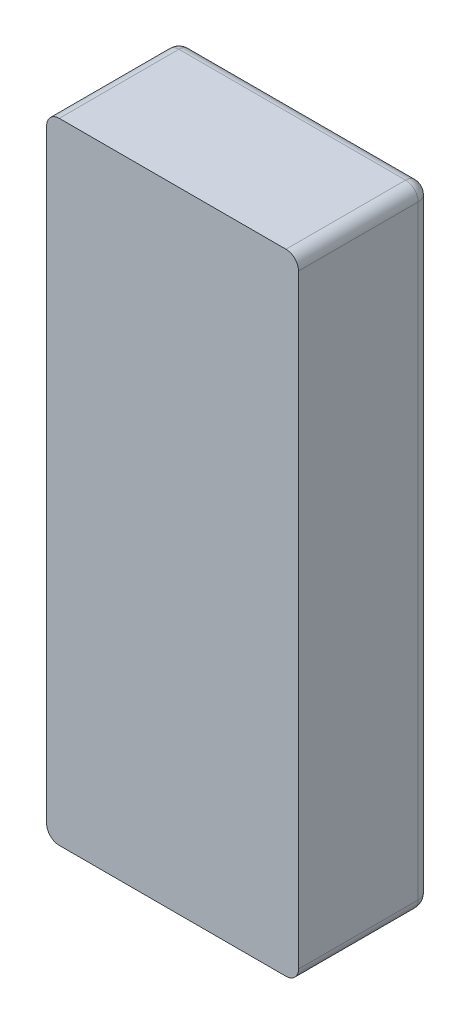
ISO-10303-21;
HEADER;
FILE_DESCRIPTION(('STEP AP214'),'2;1');
FILE_NAME('part.step','',(''),(''),'','','');
FILE_SCHEMA(('AUTOMOTIVE_DESIGN { 1 0 10303 214 1 1 1 1 }'));
ENDSEC;
DATA;
#1=APPLICATION_CONTEXT('core data for automotive mechanical design processes');
#2=APPLICATION_PROTOCOL_DEFINITION('international standard','automotive_design',2000,#1);
#3=PRODUCT_CONTEXT('',#1,'mechanical');
#4=PRODUCT('Part','Part','',(#3));
#5=PRODUCT_RELATED_PRODUCT_CATEGORY('part','',(#4));
#6=PRODUCT_DEFINITION_FORMATION('','',#4);
#7=PRODUCT_DEFINITION_CONTEXT('part definition',#1,'design');
#8=PRODUCT_DEFINITION('design','',#6,#7);
#9=PRODUCT_DEFINITION_SHAPE('','',#8);
#10=(LENGTH_UNIT() NAMED_UNIT(*) SI_UNIT(.MILLI.,.METRE.));
#11=(NAMED_UNIT(*) PLANE_ANGLE_UNIT() SI_UNIT($,.RADIAN.));
#12=(NAMED_UNIT(*) SI_UNIT($,.STERADIAN.) SOLID_ANGLE_UNIT());
#13=UNCERTAINTY_MEASURE_WITH_UNIT(LENGTH_MEASURE(1.E-05),#10,'distance_accuracy_value','');
#14=(GEOMETRIC_REPRESENTATION_CONTEXT(3) GLOBAL_UNCERTAINTY_ASSIGNED_CONTEXT((#13)) GLOBAL_UNIT_ASSIGNED_CONTEXT((#10,
#11,#12)) REPRESENTATION_CONTEXT('',''));
#15=CARTESIAN_POINT('',(0.,0.,0.));
#16=DIRECTION('',(0.,0.,1.));
#17=DIRECTION('',(1.,0.,0.));
#18=AXIS2_PLACEMENT_3D('',#15,#16,#17);
#19=CARTESIAN_POINT('',(60.00000122,78.000000648083,-2.156522083282));
#20=DIRECTION('',(0.,8.74227765734797E-08,-0.999999999999996));
#21=DIRECTION('',(0.,0.999999999999996,8.74227765734797E-08));
#22=AXIS2_PLACEMENT_3D('',#19,#20,#21);
#23=PLANE('',#22);
#24=DIRECTION('',(8.74227765734793E-08,0.999999999999992,8.74227765734793E-08));
#25=VECTOR('',#24,1.);
#26=CARTESIAN_POINT('',(59.5500011653604,77.3750006874231,-2.156522137922));
#27=LINE('',#26,#25);
#28=CARTESIAN_POINT('',(59.55000122,79.2000006874229,-2.15652197837505));
#29=VERTEX_POINT('',#28);
#30=CARTESIAN_POINT('',(59.5500011150927,76.800000687423,-2.15652218819005));
#31=VERTEX_POINT('',#30);
#32=EDGE_CURVE('E252',#29,#31,#27,.F.);
#33=ORIENTED_EDGE('',*,*,#32,.F.);
#34=DIRECTION('',(1.,0.,0.));
#35=VECTOR('',#34,1.);
#36=CARTESIAN_POINT('',(60.00000122,79.200000687423,-2.15652197837466));
#37=LINE('',#36,#35);
#38=CARTESIAN_POINT('',(60.4500013249069,79.2000006480825,-2.15652197837481));
#39=VERTEX_POINT('',#38);
#40=EDGE_CURVE('E260',#29,#39,#37,.T.);
#41=ORIENTED_EDGE('',*,*,#40,.T.);
#42=DIRECTION('',(-8.74227765734793E-08,-0.999999999999992,-8.74227765734793E-08));
#43=VECTOR('',#42,1.);
#44=CARTESIAN_POINT('',(60.450001274639,78.6250006087421,-2.156522028643));
#45=LINE('',#44,#43);
#46=CARTESIAN_POINT('',(60.4500011150927,76.8000006087424,-2.15652218818978));
#47=VERTEX_POINT('',#46);
#48=EDGE_CURVE('E96',#47,#39,#45,.F.);
#49=ORIENTED_EDGE('',*,*,#48,.F.);
#50=DIRECTION('',(-0.999999999999996,8.74227765734797E-08,0.));
#51=VECTOR('',#50,1.);
#52=CARTESIAN_POINT('',(60.250001115093,76.8000006262271,-2.15652218819));
#53=LINE('',#52,#51);
#54=EDGE_CURVE('E256',#31,#47,#53,.F.);
#55=ORIENTED_EDGE('',*,*,#54,.F.);
#56=EDGE_LOOP('',(#33,#41,#49,#55));
#57=FACE_BOUND('',#56,.T.);
#58=ADVANCED_FACE('F17',(#57),#23,.T.);
#59=CARTESIAN_POINT('',(60.450001274639,78.625000604371,-2.106522028643));
#60=DIRECTION('',(-8.74227765734793E-08,-0.999999999999992,-8.74227765734793E-08));
#61=DIRECTION('',(0.,8.74227765734797E-08,-0.999999999999996));
#62=AXIS2_PLACEMENT_3D('',#59,#60,#61);
#63=CYLINDRICAL_SURFACE('',#62,0.05);
#64=CARTESIAN_POINT('',(60.4500011150924,76.8000006043711,-2.10652218818957));
#65=DIRECTION('',(-8.74227765734793E-08,-0.999999999999992,-8.74227765734793E-08));
#66=DIRECTION('',(0.,8.74227765734797E-08,-0.999999999999996));
#67=AXIS2_PLACEMENT_3D('',#64,#65,#66);
#68=CIRCLE('',#67,0.05);
#69=CARTESIAN_POINT('',(60.5000011150926,76.8000006000001,-2.10652218818971));
#70=VERTEX_POINT('',#69);
#71=EDGE_CURVE('E20',#47,#70,#68,.T.);
#72=ORIENTED_EDGE('',*,*,#71,.F.);
#73=ORIENTED_EDGE('',*,*,#48,.T.);
#74=CARTESIAN_POINT('',(60.4500013249071,79.2000006043709,-2.1065219783749));
#75=DIRECTION('',(-8.74227765734793E-08,-0.999999999999992,-8.74227765734793E-08));
#76=DIRECTION('',(0.,8.74227765734797E-08,-0.999999999999996));
#77=AXIS2_PLACEMENT_3D('',#74,#75,#76);
#78=CIRCLE('',#77,0.05);
#79=CARTESIAN_POINT('',(60.5000013249069,79.2000005999999,-2.10652208328245));
#80=VERTEX_POINT('',#79);
#81=EDGE_CURVE('E227',#80,#39,#78,.F.);
#82=ORIENTED_EDGE('',*,*,#81,.F.);
#83=DIRECTION('',(8.74227765734797E-08,0.999999999999996,0.));
#84=VECTOR('',#83,1.);
#85=CARTESIAN_POINT('',(60.500001329278,79.250000556289,-2.10652218819));
#86=LINE('',#85,#84);
#87=EDGE_CURVE('E117',#70,#80,#86,.T.);
#88=ORIENTED_EDGE('',*,*,#87,.F.);
#89=EDGE_LOOP('',(#72,#73,#82,#88));
#90=FACE_BOUND('',#89,.T.);
#91=ADVANCED_FACE('F105',(#90),#63,.T.);
#92=CARTESIAN_POINT('',(60.450001115093,76.800000604371,-2.10652218819));
#93=DIRECTION('',(0.577350218716363,-0.577350269189147,-0.577350319663363));
#94=DIRECTION('',(0.707106781186431,-1.23634541937534E-07,0.707106781186653));
#95=AXIS2_PLACEMENT_3D('',#92,#93,#94);
#96=SPHERICAL_SURFACE('',#95,0.05);
#97=CARTESIAN_POINT('',(60.4788686260288,76.7711330909115,-2.13538970417317));
#98=VERTEX_POINT('',#97);
#99=VERTEX_LOOP('',#98);
#100=FACE_BOUND('',#99,.T.);
#101=CARTESIAN_POINT('',(60.450001115093,76.8000006043714,-2.10652218818986));
#102=DIRECTION('',(0.,8.74227765734797E-08,-0.999999999999996));
#103=DIRECTION('',(0.,0.999999999999996,8.74227765734797E-08));
#104=AXIS2_PLACEMENT_3D('',#101,#102,#103);
#105=CIRCLE('',#104,0.05);
#106=CARTESIAN_POINT('',(60.4500011107219,76.7500006043715,-2.10652219256107));
#107=VERTEX_POINT('',#106);
#108=EDGE_CURVE('E111',#107,#70,#105,.F.);
#109=ORIENTED_EDGE('',*,*,#108,.F.);
#110=CARTESIAN_POINT('',(60.450001115093,76.8000006043714,-2.10652218819));
#111=DIRECTION('',(-0.999999999999996,8.74227765734797E-08,0.));
#112=DIRECTION('',(-8.74227765734797E-08,-0.999999999999996,0.));
#113=AXIS2_PLACEMENT_3D('',#110,#111,#112);
#114=CIRCLE('',#113,0.05);
#115=EDGE_CURVE('E113',#47,#107,#114,.T.);
#116=ORIENTED_EDGE('',*,*,#115,.F.);
#117=ORIENTED_EDGE('',*,*,#71,.T.);
#118=EDGE_LOOP('',(#109,#116,#117));
#119=FACE_BOUND('',#118,.T.);
#120=ADVANCED_FACE('F101',(#100,#119),#96,.T.);
#121=CARTESIAN_POINT('',(60.250001115093,76.800000621856,-2.10652218819));
#122=DIRECTION('',(-0.999999999999996,8.74227765734797E-08,0.));
#123=DIRECTION('',(-8.74227765734797E-08,-0.999999999999996,0.));
#124=AXIS2_PLACEMENT_3D('',#121,#122,#123);
#125=CYLINDRICAL_SURFACE('',#124,0.05);
#126=CARTESIAN_POINT('',(59.5500011150931,76.8000006830519,-2.10652218818999));
#127=DIRECTION('',(-0.999999999999996,8.74227765734797E-08,0.));
#128=DIRECTION('',(-8.74227765734797E-08,-0.999999999999996,0.));
#129=AXIS2_PLACEMENT_3D('',#126,#127,#128);
#130=CIRCLE('',#129,0.05);
#131=CARTESIAN_POINT('',(59.5500011107219,76.7500006830517,-2.10652219256114));
#132=VERTEX_POINT('',#131);
#133=EDGE_CURVE('E255',#31,#132,#130,.T.);
#134=ORIENTED_EDGE('',*,*,#133,.F.);
#135=ORIENTED_EDGE('',*,*,#54,.T.);
#136=ORIENTED_EDGE('',*,*,#115,.T.);
#137=DIRECTION('',(0.999999999999996,-8.7422776573479E-08,0.));
#138=VECTOR('',#137,1.);
#139=CARTESIAN_POINT('',(60.500001110722,76.7500006000004,-2.10652219256101));
#140=LINE('',#139,#138);
#141=EDGE_CURVE('E129',#132,#107,#140,.T.);
#142=ORIENTED_EDGE('',*,*,#141,.F.);
#143=EDGE_LOOP('',(#134,#135,#136,#142));
#144=FACE_BOUND('',#143,.T.);
#145=ADVANCED_FACE('F104',(#144),#125,.T.);
#146=CARTESIAN_POINT('',(59.550001115093,76.800000683052,-2.10652218819));
#147=DIRECTION('',(-0.577350319663375,-0.577350168242114,-0.577350319663375));
#148=DIRECTION('',(0.707106781186548,0.,-0.707106781186548));
#149=AXIS2_PLACEMENT_3D('',#146,#147,#148);
#150=SPHERICAL_SURFACE('',#149,0.05);
#151=CARTESIAN_POINT('',(59.5211335991098,76.7711331746399,-2.13538970417317));
#152=VERTEX_POINT('',#151);
#153=VERTEX_LOOP('',#152);
#154=FACE_BOUND('',#153,.T.);
#155=CARTESIAN_POINT('',(59.550001115093,76.8000006830514,-2.10652218819));
#156=DIRECTION('',(0.,8.74227765734797E-08,-0.999999999999996));
#157=DIRECTION('',(0.,0.999999999999996,8.74227765734797E-08));
#158=AXIS2_PLACEMENT_3D('',#155,#156,#157);
#159=CIRCLE('',#158,0.05);
#160=CARTESIAN_POINT('',(59.5000011150931,76.800000687423,-2.10652208328255));
#161=VERTEX_POINT('',#160);
#162=EDGE_CURVE('E128',#161,#132,#159,.F.);
#163=ORIENTED_EDGE('',*,*,#162,.F.);
#164=CARTESIAN_POINT('',(59.5500011150929,76.8000006830519,-2.1065221881901));
#165=DIRECTION('',(8.74227765734793E-08,0.999999999999992,8.74227765734793E-08));
#166=DIRECTION('',(0.,-8.74227765734797E-08,0.999999999999996));
#167=AXIS2_PLACEMENT_3D('',#164,#165,#166);
#168=CIRCLE('',#167,0.05);
#169=EDGE_CURVE('E253',#31,#161,#168,.T.);
#170=ORIENTED_EDGE('',*,*,#169,.F.);
#171=ORIENTED_EDGE('',*,*,#133,.T.);
#172=EDGE_LOOP('',(#163,#170,#171));
#173=FACE_BOUND('',#172,.T.);
#174=ADVANCED_FACE('F173',(#154,#173),#150,.T.);
#175=CARTESIAN_POINT('',(59.550001165361,77.375000683052,-2.106522137922));
#176=DIRECTION('',(8.74227765734793E-08,0.999999999999992,8.74227765734793E-08));
#177=DIRECTION('',(0.,-8.74227765734797E-08,0.999999999999996));
#178=AXIS2_PLACEMENT_3D('',#175,#176,#177);
#179=CYLINDRICAL_SURFACE('',#178,0.05);
#180=CARTESIAN_POINT('',(59.5500013249076,79.2000006830519,-2.10652197837543));
#181=DIRECTION('',(8.74227765734793E-08,0.999999999999992,8.74227765734793E-08));
#182=DIRECTION('',(0.,-8.74227765734797E-08,0.999999999999996));
#183=AXIS2_PLACEMENT_3D('',#180,#181,#182);
#184=CIRCLE('',#183,0.05);
#185=CARTESIAN_POINT('',(59.5000013249074,79.2000006874228,-2.10652197837529));
#186=VERTEX_POINT('',#185);
#187=EDGE_CURVE('E250',#29,#186,#184,.T.);
#188=ORIENTED_EDGE('',*,*,#187,.F.);
#189=ORIENTED_EDGE('',*,*,#32,.T.);
#190=ORIENTED_EDGE('',*,*,#169,.T.);
#191=DIRECTION('',(-8.74227765734797E-08,-0.999999999999996,0.));
#192=VECTOR('',#191,1.);
#193=CARTESIAN_POINT('',(59.500001110722,76.750000643711,-2.106521978375));
#194=LINE('',#193,#192);
#195=EDGE_CURVE('E167',#186,#161,#194,.T.);
#196=ORIENTED_EDGE('',*,*,#195,.F.);
#197=EDGE_LOOP('',(#188,#189,#190,#196));
#198=FACE_BOUND('',#197,.T.);
#199=ADVANCED_FACE('F163',(#198),#179,.T.);
#200=CARTESIAN_POINT('',(59.550001324907,79.200000683052,-2.106521978375));
#201=DIRECTION('',(-0.577350218716104,0.577350370136657,-0.577350218716104));
#202=DIRECTION('',(0.707106781186548,0.,-0.707106781186548));
#203=AXIS2_PLACEMENT_3D('',#200,#201,#202);
#204=SPHERICAL_SURFACE('',#203,0.05);
#205=CARTESIAN_POINT('',(59.5211338139712,79.2288682015588,-2.1353894893108));
#206=VERTEX_POINT('',#205);
#207=VERTEX_LOOP('',#206);
#208=FACE_BOUND('',#207,.T.);
#209=CARTESIAN_POINT('',(59.550001324907,79.2000006830514,-2.10652197837514));
#210=DIRECTION('',(0.,8.74227765734797E-08,-0.999999999999996));
#211=DIRECTION('',(0.,0.999999999999996,8.74227765734797E-08));
#212=AXIS2_PLACEMENT_3D('',#209,#210,#211);
#213=CIRCLE('',#212,0.05);
#214=CARTESIAN_POINT('',(59.5500013292781,79.2500006830514,-2.10652197400393));
#215=VERTEX_POINT('',#214);
#216=EDGE_CURVE('E243',#215,#186,#213,.F.);
#217=ORIENTED_EDGE('',*,*,#216,.F.);
#218=CARTESIAN_POINT('',(59.550001324907,79.2000006830516,-2.106521978375));
#219=DIRECTION('',(0.999999999999996,-8.74227765734797E-08,0.));
#220=DIRECTION('',(8.74227765734797E-08,0.999999999999996,0.));
#221=AXIS2_PLACEMENT_3D('',#218,#219,#220);
#222=CIRCLE('',#221,0.05);
#223=EDGE_CURVE('E248',#29,#215,#222,.T.);
#224=ORIENTED_EDGE('',*,*,#223,.F.);
#225=ORIENTED_EDGE('',*,*,#187,.T.);
#226=EDGE_LOOP('',(#217,#224,#225));
#227=FACE_BOUND('',#226,.T.);
#228=ADVANCED_FACE('F158',(#208,#227),#204,.T.);
#229=CARTESIAN_POINT('',(59.750001324907,79.200000665567,-2.106521978375));
#230=DIRECTION('',(0.999999999999996,-8.74227765734797E-08,0.));
#231=DIRECTION('',(8.74227765734797E-08,0.999999999999996,0.));
#232=AXIS2_PLACEMENT_3D('',#229,#230,#231);
#233=CYLINDRICAL_SURFACE('',#232,0.05);
#234=CARTESIAN_POINT('',(60.4500013249069,79.2000006043711,-2.10652197837501));
#235=DIRECTION('',(0.999999999999996,-8.74227765734797E-08,0.));
#236=DIRECTION('',(8.74227765734797E-08,0.999999999999996,0.));
#237=AXIS2_PLACEMENT_3D('',#234,#235,#236);
#238=CIRCLE('',#237,0.05);
#239=CARTESIAN_POINT('',(60.4500013270926,79.2500006043711,-2.10652197400386));
#240=VERTEX_POINT('',#239);
#241=EDGE_CURVE('E235',#39,#240,#238,.T.);
#242=ORIENTED_EDGE('',*,*,#241,.F.);
#243=ORIENTED_EDGE('',*,*,#40,.F.);
#244=ORIENTED_EDGE('',*,*,#223,.T.);
#245=DIRECTION('',(0.999999999999996,-8.7422776573479E-08,0.));
#246=VECTOR('',#245,1.);
#247=CARTESIAN_POINT('',(59.500001329278,79.2500006874224,-2.10652197400399));
#248=LINE('',#247,#246);
#249=EDGE_CURVE('E139',#240,#215,#248,.F.);
#250=ORIENTED_EDGE('',*,*,#249,.F.);
#251=EDGE_LOOP('',(#242,#243,#244,#250));
#252=FACE_BOUND('',#251,.T.);
#253=ADVANCED_FACE('F153',(#252),#233,.T.);
#254=CARTESIAN_POINT('',(60.450001324907,79.200000604371,-2.106521978375));
#255=DIRECTION('',(0.577350319663363,0.577350269189147,-0.577350218716363));
#256=DIRECTION('',(0.707106781186653,-1.23634541937534E-07,0.707106781186431));
#257=AXIS2_PLACEMENT_3D('',#254,#255,#256);
#258=SPHERICAL_SURFACE('',#257,0.05);
#259=CARTESIAN_POINT('',(60.4788688408902,79.2288681178305,-2.13538948931082));
#260=VERTEX_POINT('',#259);
#261=VERTEX_LOOP('',#260);
#262=FACE_BOUND('',#261,.T.);
#263=CARTESIAN_POINT('',(60.450001324907,79.2000006043714,-2.106521978375));
#264=DIRECTION('',(0.,8.74227765734797E-08,-0.999999999999996));
#265=DIRECTION('',(0.,0.999999999999996,8.74227765734797E-08));
#266=AXIS2_PLACEMENT_3D('',#263,#264,#265);
#267=CIRCLE('',#266,0.05);
#268=EDGE_CURVE('E229',#80,#240,#267,.F.);
#269=ORIENTED_EDGE('',*,*,#268,.F.);
#270=ORIENTED_EDGE('',*,*,#81,.T.);
#271=ORIENTED_EDGE('',*,*,#241,.T.);
#272=EDGE_LOOP('',(#269,#270,#271));
#273=FACE_BOUND('',#272,.T.);
#274=ADVANCED_FACE('F148',(#262,#273),#258,.T.);
#275=CARTESIAN_POINT('',(60.500001329278,79.250000556289,-1.606521974004));
#276=DIRECTION('',(0.999999999999996,-8.74227765734797E-08,0.));
#277=DIRECTION('',(8.74227765734797E-08,0.999999999999996,0.));
#278=AXIS2_PLACEMENT_3D('',#275,#276,#277);
#279=PLANE('',#278);
#280=ORIENTED_EDGE('',*,*,#87,.T.);
#281=DIRECTION('',(0.,8.74227765734797E-08,-0.999999999999996));
#282=VECTOR('',#281,1.);
#283=CARTESIAN_POINT('',(60.500001324907,79.2000005562884,-1.606521978375));
#284=LINE('',#283,#282);
#285=CARTESIAN_POINT('',(60.500001324907,79.2000005606598,-1.63152197837514));
#286=VERTEX_POINT('',#285);
#287=EDGE_CURVE('E225',#286,#80,#284,.T.);
#288=ORIENTED_EDGE('',*,*,#287,.F.);
#289=DIRECTION('',(0.,0.999999999999996,8.74227765734797E-08));
#290=VECTOR('',#289,1.);
#291=CARTESIAN_POINT('',(60.500001324907,81.118392505247,-1.631521810664));
#292=LINE('',#291,#290);
#293=CARTESIAN_POINT('',(60.50000122,76.8000005606599,-1.63152218819));
#294=VERTEX_POINT('',#293);
#295=EDGE_CURVE('E238',#286,#294,#292,.F.);
#296=ORIENTED_EDGE('',*,*,#295,.T.);
#297=DIRECTION('',(0.,8.74227765734797E-08,-0.999999999999996));
#298=VECTOR('',#297,1.);
#299=CARTESIAN_POINT('',(60.500001115093,76.8000005562886,-1.60652218819));
#300=LINE('',#299,#298);
#301=EDGE_CURVE('E116',#70,#294,#300,.F.);
#302=ORIENTED_EDGE('',*,*,#301,.F.);
#303=EDGE_LOOP('',(#280,#288,#296,#302));
#304=FACE_BOUND('',#303,.T.);
#305=ADVANCED_FACE('F152',(#304),#279,.T.);
#306=CARTESIAN_POINT('',(60.450001115093,76.80000056066,-1.60652218819));
#307=DIRECTION('',(0.,8.74227765734797E-08,-0.999999999999996));
#308=DIRECTION('',(0.,0.999999999999996,8.74227765734797E-08));
#309=AXIS2_PLACEMENT_3D('',#306,#307,#308);
#310=CYLINDRICAL_SURFACE('',#309,0.05);
#311=ORIENTED_EDGE('',*,*,#108,.T.);
#312=ORIENTED_EDGE('',*,*,#301,.T.);
#313=CARTESIAN_POINT('',(60.450001115093,76.8000005628456,-1.63152218819));
#314=DIRECTION('',(0.,8.74227765734797E-08,-0.999999999999996));
#315=DIRECTION('',(0.,0.999999999999996,8.74227765734797E-08));
#316=AXIS2_PLACEMENT_3D('',#313,#314,#315);
#317=CIRCLE('',#316,0.05);
#318=CARTESIAN_POINT('',(60.4500011129075,76.7500005628454,-1.63152219256114));
#319=VERTEX_POINT('',#318);
#320=EDGE_CURVE('E123',#294,#319,#317,.T.);
#321=ORIENTED_EDGE('',*,*,#320,.T.);
#322=DIRECTION('',(0.,8.74227765734797E-08,-0.999999999999996));
#323=VECTOR('',#322,1.);
#324=CARTESIAN_POINT('',(60.450001110722,76.7500005606601,-1.606522192561));
#325=LINE('',#324,#323);
#326=EDGE_CURVE('E120',#107,#319,#325,.F.);
#327=ORIENTED_EDGE('',*,*,#326,.F.);
#328=EDGE_LOOP('',(#311,#312,#321,#327));
#329=FACE_BOUND('',#328,.T.);
#330=ADVANCED_FACE('F121',(#329),#310,.T.);
#331=CARTESIAN_POINT('',(60.500001110722,76.750000556289,-1.606522192561));
#332=DIRECTION('',(-8.74227765734793E-08,-0.999999999999992,-8.74227765734793E-08));
#333=DIRECTION('',(0.,8.74227765734797E-08,-0.999999999999996));
#334=AXIS2_PLACEMENT_3D('',#331,#332,#333);
#335=PLANE('',#334);
#336=ORIENTED_EDGE('',*,*,#141,.T.);
#337=ORIENTED_EDGE('',*,*,#326,.T.);
#338=DIRECTION('',(1.,0.,0.));
#339=VECTOR('',#338,1.);
#340=CARTESIAN_POINT('',(59.500001492618,76.750000562845,-1.63152219256095));
#341=LINE('',#340,#339);
#342=CARTESIAN_POINT('',(59.5500011129075,76.7500006021853,-1.631522192561));
#343=VERTEX_POINT('',#342);
#344=EDGE_CURVE('E270',#319,#343,#341,.F.);
#345=ORIENTED_EDGE('',*,*,#344,.T.);
#346=DIRECTION('',(0.,8.74227765734797E-08,-0.999999999999996));
#347=VECTOR('',#346,1.);
#348=CARTESIAN_POINT('',(59.550001110722,76.75000063934,-1.60652219256114));
#349=LINE('',#348,#347);
#350=EDGE_CURVE('E132',#132,#343,#349,.F.);
#351=ORIENTED_EDGE('',*,*,#350,.F.);
#352=EDGE_LOOP('',(#336,#337,#345,#351));
#353=FACE_BOUND('',#352,.T.);
#354=ADVANCED_FACE('F211',(#353),#335,.T.);
#355=CARTESIAN_POINT('',(59.550001115093,76.80000063934,-1.60652218819));
#356=DIRECTION('',(0.,8.74227765734797E-08,-0.999999999999996));
#357=DIRECTION('',(0.,0.999999999999996,8.74227765734797E-08));
#358=AXIS2_PLACEMENT_3D('',#355,#356,#357);
#359=CYLINDRICAL_SURFACE('',#358,0.05);
#360=ORIENTED_EDGE('',*,*,#162,.T.);
#361=ORIENTED_EDGE('',*,*,#350,.T.);
#362=CARTESIAN_POINT('',(59.550001115093,76.8000006415256,-1.63152218818986));
#363=DIRECTION('',(0.,8.74227765734797E-08,-0.999999999999996));
#364=DIRECTION('',(0.,0.999999999999996,8.74227765734797E-08));
#365=AXIS2_PLACEMENT_3D('',#362,#363,#364);
#366=CIRCLE('',#365,0.05);
#367=CARTESIAN_POINT('',(59.5000011150931,76.8000006644743,-1.63152218818986));
#368=VERTEX_POINT('',#367);
#369=EDGE_CURVE('E268',#343,#368,#366,.T.);
#370=ORIENTED_EDGE('',*,*,#369,.T.);
#371=DIRECTION('',(0.,0.,1.));
#372=VECTOR('',#371,1.);
#373=CARTESIAN_POINT('',(59.5000011150931,76.800000687423,-1.606522192561));
#374=LINE('',#373,#372);
#375=EDGE_CURVE('E245',#161,#368,#374,.T.);
#376=ORIENTED_EDGE('',*,*,#375,.F.);
#377=EDGE_LOOP('',(#360,#361,#370,#376));
#378=FACE_BOUND('',#377,.T.);
#379=ADVANCED_FACE('F207',(#378),#359,.T.);
#380=CARTESIAN_POINT('',(59.500001110722,76.750000643711,-1.606522192561));
#381=DIRECTION('',(-0.999999999999996,8.74227765734797E-08,0.));
#382=DIRECTION('',(-8.74227765734797E-08,-0.999999999999996,0.));
#383=AXIS2_PLACEMENT_3D('',#380,#381,#382);
#384=PLANE('',#383);
#385=ORIENTED_EDGE('',*,*,#195,.T.);
#386=ORIENTED_EDGE('',*,*,#375,.T.);
#387=DIRECTION('',(0.,0.999999999999996,8.74227765734797E-08));
#388=VECTOR('',#387,1.);
#389=CARTESIAN_POINT('',(59.500001115093,81.118392505247,-1.631521810664));
#390=LINE('',#389,#388);
#391=CARTESIAN_POINT('',(59.50000122,79.2000006437114,-1.631521978375));
#392=VERTEX_POINT('',#391);
#393=EDGE_CURVE('E267',#368,#392,#390,.T.);
#394=ORIENTED_EDGE('',*,*,#393,.T.);
#395=DIRECTION('',(0.,8.74227765734797E-08,-0.999999999999996));
#396=VECTOR('',#395,1.);
#397=CARTESIAN_POINT('',(59.500001324907,79.2000006437116,-1.606521978375));
#398=LINE('',#397,#396);
#399=EDGE_CURVE('E143',#186,#392,#398,.F.);
#400=ORIENTED_EDGE('',*,*,#399,.F.);
#401=EDGE_LOOP('',(#385,#386,#394,#400));
#402=FACE_BOUND('',#401,.T.);
#403=ADVANCED_FACE('F203',(#402),#384,.T.);
#404=CARTESIAN_POINT('',(59.550001324907,79.20000063934,-1.606521978375));
#405=DIRECTION('',(0.,8.74227765734797E-08,-0.999999999999996));
#406=DIRECTION('',(0.,0.999999999999996,8.74227765734797E-08));
#407=AXIS2_PLACEMENT_3D('',#404,#405,#406);
#408=CYLINDRICAL_SURFACE('',#407,0.05);
#409=ORIENTED_EDGE('',*,*,#216,.T.);
#410=ORIENTED_EDGE('',*,*,#399,.T.);
#411=CARTESIAN_POINT('',(59.550001324907,79.2000006415256,-1.631521978375));
#412=DIRECTION('',(0.,8.74227765734797E-08,-0.999999999999996));
#413=DIRECTION('',(0.,0.999999999999996,8.74227765734797E-08));
#414=AXIS2_PLACEMENT_3D('',#411,#412,#413);
#415=CIRCLE('',#414,0.05);
#416=CARTESIAN_POINT('',(59.5500013270925,79.2500006415257,-1.63152197400386));
#417=VERTEX_POINT('',#416);
#418=EDGE_CURVE('E265',#392,#417,#415,.T.);
#419=ORIENTED_EDGE('',*,*,#418,.T.);
#420=DIRECTION('',(0.,-8.74227765734797E-08,0.999999999999996));
#421=VECTOR('',#420,1.);
#422=CARTESIAN_POINT('',(59.550001329278,79.2500006393399,-1.606521974004));
#423=LINE('',#422,#421);
#424=EDGE_CURVE('E142',#215,#417,#423,.T.);
#425=ORIENTED_EDGE('',*,*,#424,.F.);
#426=EDGE_LOOP('',(#409,#410,#419,#425));
#427=FACE_BOUND('',#426,.T.);
#428=ADVANCED_FACE('F199',(#427),#408,.T.);
#429=CARTESIAN_POINT('',(59.500001329278,79.250000643711,-1.606521974004));
#430=DIRECTION('',(8.74227765734793E-08,0.999999999999992,8.74227765734793E-08));
#431=DIRECTION('',(0.,-8.74227765734797E-08,0.999999999999996));
#432=AXIS2_PLACEMENT_3D('',#429,#430,#431);
#433=PLANE('',#432);
#434=ORIENTED_EDGE('',*,*,#249,.T.);
#435=ORIENTED_EDGE('',*,*,#424,.T.);
#436=DIRECTION('',(1.,0.,0.));
#437=VECTOR('',#436,1.);
#438=CARTESIAN_POINT('',(59.500001492618,79.250000641526,-1.631521974004));
#439=LINE('',#438,#437);
#440=CARTESIAN_POINT('',(60.450001324907,79.2500006021858,-1.631521974004));
#441=VERTEX_POINT('',#440);
#442=EDGE_CURVE('E26',#417,#441,#439,.T.);
#443=ORIENTED_EDGE('',*,*,#442,.T.);
#444=DIRECTION('',(0.,8.74227765734797E-08,-0.999999999999996));
#445=VECTOR('',#444,1.);
#446=CARTESIAN_POINT('',(60.450001324907,79.25000056066,-1.60652197400386));
#447=LINE('',#446,#445);
#448=EDGE_CURVE('E34',#240,#441,#447,.F.);
#449=ORIENTED_EDGE('',*,*,#448,.F.);
#450=EDGE_LOOP('',(#434,#435,#443,#449));
#451=FACE_BOUND('',#450,.T.);
#452=ADVANCED_FACE('F193',(#451),#433,.T.);
#453=CARTESIAN_POINT('',(60.450001324907,79.20000056066,-1.606521978375));
#454=DIRECTION('',(0.,8.74227765734797E-08,-0.999999999999996));
#455=DIRECTION('',(0.,0.999999999999996,8.74227765734797E-08));
#456=AXIS2_PLACEMENT_3D('',#453,#454,#455);
#457=CYLINDRICAL_SURFACE('',#456,0.05);
#458=ORIENTED_EDGE('',*,*,#268,.T.);
#459=ORIENTED_EDGE('',*,*,#448,.T.);
#460=CARTESIAN_POINT('',(60.450001324907,79.2000005628456,-1.63152197837514));
#461=DIRECTION('',(0.,8.74227765734797E-08,-0.999999999999996));
#462=DIRECTION('',(0.,0.999999999999996,8.74227765734797E-08));
#463=AXIS2_PLACEMENT_3D('',#460,#461,#462);
#464=CIRCLE('',#463,0.05);
#465=EDGE_CURVE('E11',#441,#286,#464,.T.);
#466=ORIENTED_EDGE('',*,*,#465,.T.);
#467=ORIENTED_EDGE('',*,*,#287,.T.);
#468=EDGE_LOOP('',(#458,#459,#466,#467));
#469=FACE_BOUND('',#468,.T.);
#470=ADVANCED_FACE('F187',(#469),#457,.T.);
#471=CARTESIAN_POINT('',(59.500001492618,81.118392505247,-1.631521810664));
#472=DIRECTION('',(0.,8.74227765734797E-08,-0.999999999999996));
#473=DIRECTION('',(0.,0.999999999999996,8.74227765734797E-08));
#474=AXIS2_PLACEMENT_3D('',#471,#472,#473);
#475=PLANE('',#474);
#476=ORIENTED_EDGE('',*,*,#442,.F.);
#477=ORIENTED_EDGE('',*,*,#418,.F.);
#478=ORIENTED_EDGE('',*,*,#393,.F.);
#479=ORIENTED_EDGE('',*,*,#369,.F.);
#480=ORIENTED_EDGE('',*,*,#344,.F.);
#481=ORIENTED_EDGE('',*,*,#320,.F.);
#482=ORIENTED_EDGE('',*,*,#295,.F.);
#483=ORIENTED_EDGE('',*,*,#465,.F.);
#484=EDGE_LOOP('',(#476,#477,#478,#479,#480,#481,#482,#483));
#485=FACE_BOUND('',#484,.T.);
#486=ADVANCED_FACE('F185',(#485),#475,.F.);
#487=CLOSED_SHELL('',(#58,#91,#120,#145,#174,#199,#228,#253,#274,#305,#330,#354,#379,#403,#428,
#452,#470,#486));
#488=MANIFOLD_SOLID_BREP('B1',#487);
#489=ADVANCED_BREP_SHAPE_REPRESENTATION('',(#18,#488),#14);
#490=SHAPE_DEFINITION_REPRESENTATION(#9,#489);
ENDSEC;
END-ISO-10303-21;
